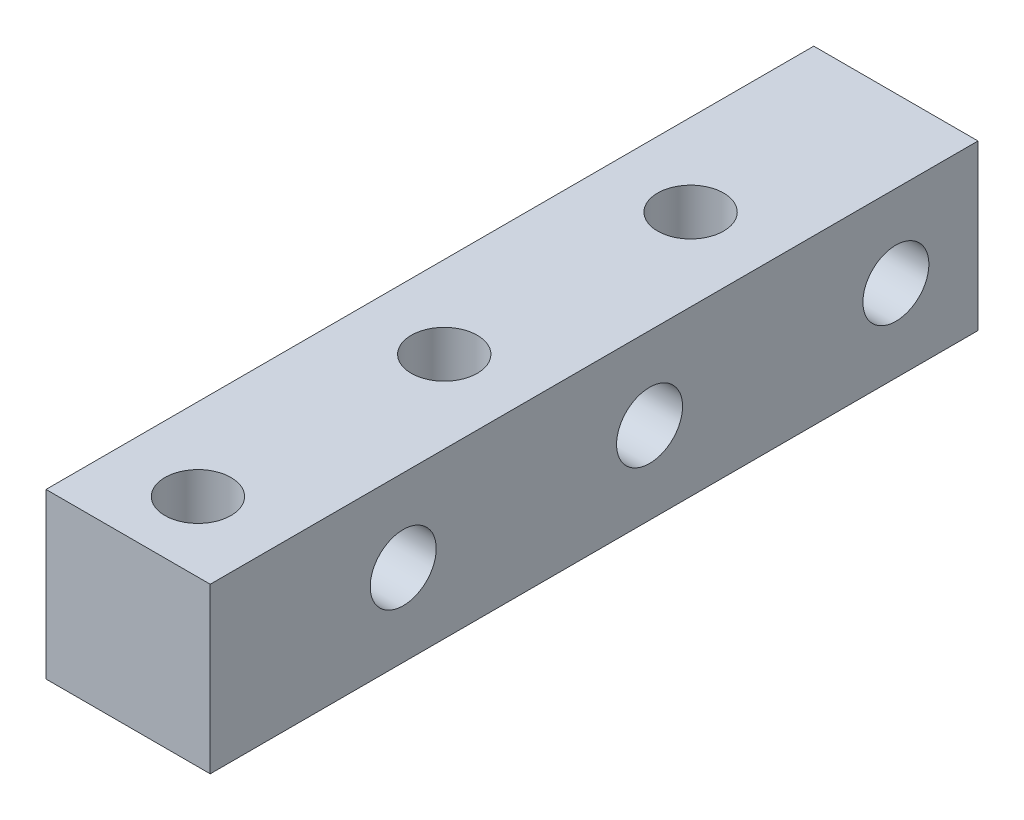
ISO-10303-21;
HEADER;
FILE_DESCRIPTION(('STEP AP214'),'2;1');
FILE_NAME('part.step','',(''),(''),'','','');
FILE_SCHEMA(('AUTOMOTIVE_DESIGN { 1 0 10303 214 1 1 1 1 }'));
ENDSEC;
DATA;
#1=APPLICATION_CONTEXT('core data for automotive mechanical design processes');
#2=APPLICATION_PROTOCOL_DEFINITION('international standard','automotive_design',2000,#1);
#3=PRODUCT_CONTEXT('',#1,'mechanical');
#4=PRODUCT('Part','Part','',(#3));
#5=PRODUCT_RELATED_PRODUCT_CATEGORY('part','',(#4));
#6=PRODUCT_DEFINITION_FORMATION('','',#4);
#7=PRODUCT_DEFINITION_CONTEXT('part definition',#1,'design');
#8=PRODUCT_DEFINITION('design','',#6,#7);
#9=PRODUCT_DEFINITION_SHAPE('','',#8);
#10=(LENGTH_UNIT() NAMED_UNIT(*) SI_UNIT(.MILLI.,.METRE.));
#11=(NAMED_UNIT(*) PLANE_ANGLE_UNIT() SI_UNIT($,.RADIAN.));
#12=(NAMED_UNIT(*) SI_UNIT($,.STERADIAN.) SOLID_ANGLE_UNIT());
#13=UNCERTAINTY_MEASURE_WITH_UNIT(LENGTH_MEASURE(1.E-05),#10,'distance_accuracy_value','');
#14=(GEOMETRIC_REPRESENTATION_CONTEXT(3) GLOBAL_UNCERTAINTY_ASSIGNED_CONTEXT((#13)) GLOBAL_UNIT_ASSIGNED_CONTEXT((#10,
#11,#12)) REPRESENTATION_CONTEXT('',''));
#15=CARTESIAN_POINT('',(0.,0.,0.));
#16=DIRECTION('',(0.,0.,1.));
#17=DIRECTION('',(1.,0.,0.));
#18=AXIS2_PLACEMENT_3D('',#15,#16,#17);
#19=CARTESIAN_POINT('',(6.35,-6.35,-85.725));
#20=DIRECTION('',(0.,-1.,0.));
#21=DIRECTION('',(1.,0.,0.));
#22=AXIS2_PLACEMENT_3D('',#19,#20,#21);
#23=PLANE('',#22);
#24=CARTESIAN_POINT('',(0.,-6.35,-25.4));
#25=DIRECTION('',(0.,1.,0.));
#26=DIRECTION('',(0.,0.,1.));
#27=AXIS2_PLACEMENT_3D('',#24,#25,#26);
#28=CIRCLE('',#27,2.5527);
#29=CARTESIAN_POINT('',(0.,-6.35,-22.8473));
#30=VERTEX_POINT('',#29);
#31=EDGE_CURVE('E124',#30,#30,#28,.T.);
#32=ORIENTED_EDGE('',*,*,#31,.T.);
#33=EDGE_LOOP('',(#32));
#34=FACE_BOUND('',#33,.T.);
#35=CARTESIAN_POINT('',(0.,-6.35,-44.45));
#36=DIRECTION('',(0.,1.,0.));
#37=DIRECTION('',(0.,0.,1.));
#38=AXIS2_PLACEMENT_3D('',#35,#36,#37);
#39=CIRCLE('',#38,2.5527);
#40=CARTESIAN_POINT('',(0.,-6.35,-41.8973));
#41=VERTEX_POINT('',#40);
#42=EDGE_CURVE('E164',#41,#41,#39,.T.);
#43=ORIENTED_EDGE('',*,*,#42,.T.);
#44=EDGE_LOOP('',(#43));
#45=FACE_BOUND('',#44,.T.);
#46=CARTESIAN_POINT('',(0.,-6.35,-63.5));
#47=DIRECTION('',(0.,1.,0.));
#48=DIRECTION('',(0.,0.,1.));
#49=AXIS2_PLACEMENT_3D('',#46,#47,#48);
#50=CIRCLE('',#49,2.5527);
#51=CARTESIAN_POINT('',(0.,-6.35,-60.9473));
#52=VERTEX_POINT('',#51);
#53=EDGE_CURVE('E159',#52,#52,#50,.T.);
#54=ORIENTED_EDGE('',*,*,#53,.T.);
#55=EDGE_LOOP('',(#54));
#56=FACE_BOUND('',#55,.T.);
#57=DIRECTION('',(0.,0.,-1.));
#58=VECTOR('',#57,1.);
#59=CARTESIAN_POINT('',(6.35,-6.35,-85.725));
#60=LINE('',#59,#58);
#61=CARTESIAN_POINT('',(6.35,-6.35,-20.));
#62=VERTEX_POINT('',#61);
#63=CARTESIAN_POINT('',(6.35,-6.35,-79.375));
#64=VERTEX_POINT('',#63);
#65=EDGE_CURVE('E127',#62,#64,#60,.T.);
#66=ORIENTED_EDGE('',*,*,#65,.F.);
#67=DIRECTION('',(1.,0.,0.));
#68=VECTOR('',#67,1.);
#69=CARTESIAN_POINT('',(0.,-6.35,-20.));
#70=LINE('',#69,#68);
#71=CARTESIAN_POINT('',(-6.35000000000001,-6.35,-20.));
#72=VERTEX_POINT('',#71);
#73=EDGE_CURVE('E95',#72,#62,#70,.T.);
#74=ORIENTED_EDGE('',*,*,#73,.F.);
#75=DIRECTION('',(0.,0.,1.));
#76=VECTOR('',#75,1.);
#77=CARTESIAN_POINT('',(-6.35,-6.35,-85.725));
#78=LINE('',#77,#76);
#79=CARTESIAN_POINT('',(-6.35,-6.35,-79.375));
#80=VERTEX_POINT('',#79);
#81=EDGE_CURVE('E112',#80,#72,#78,.T.);
#82=ORIENTED_EDGE('',*,*,#81,.F.);
#83=DIRECTION('',(1.,0.,0.));
#84=VECTOR('',#83,1.);
#85=CARTESIAN_POINT('',(-6.35000000000001,-6.35,-79.375));
#86=LINE('',#85,#84);
#87=EDGE_CURVE('E89',#80,#64,#86,.T.);
#88=ORIENTED_EDGE('',*,*,#87,.T.);
#89=EDGE_LOOP('',(#66,#74,#82,#88));
#90=FACE_BOUND('',#89,.T.);
#91=ADVANCED_FACE('F49',(#34,#45,#56,#90),#23,.T.);
#92=CARTESIAN_POINT('',(-6.35,-6.35,-85.725));
#93=DIRECTION('',(-1.,0.,0.));
#94=DIRECTION('',(0.,0.,1.));
#95=AXIS2_PLACEMENT_3D('',#92,#93,#94);
#96=PLANE('',#95);
#97=CARTESIAN_POINT('',(-6.35,0.,-73.025));
#98=DIRECTION('',(1.,0.,0.));
#99=DIRECTION('',(0.,0.,-1.));
#100=AXIS2_PLACEMENT_3D('',#97,#98,#99);
#101=CIRCLE('',#100,2.55269999999999);
#102=CARTESIAN_POINT('',(-6.35,0.,-75.5777));
#103=VERTEX_POINT('',#102);
#104=EDGE_CURVE('E53',#103,#103,#101,.T.);
#105=ORIENTED_EDGE('',*,*,#104,.T.);
#106=EDGE_LOOP('',(#105));
#107=FACE_BOUND('',#106,.T.);
#108=CARTESIAN_POINT('',(-6.35,0.,-53.975));
#109=DIRECTION('',(1.,0.,0.));
#110=DIRECTION('',(0.,0.,-1.));
#111=AXIS2_PLACEMENT_3D('',#108,#109,#110);
#112=CIRCLE('',#111,2.5527);
#113=CARTESIAN_POINT('',(-6.35,0.,-56.5277));
#114=VERTEX_POINT('',#113);
#115=EDGE_CURVE('E180',#114,#114,#112,.T.);
#116=ORIENTED_EDGE('',*,*,#115,.T.);
#117=EDGE_LOOP('',(#116));
#118=FACE_BOUND('',#117,.T.);
#119=CARTESIAN_POINT('',(-6.35,0.,-34.925));
#120=DIRECTION('',(1.,0.,0.));
#121=DIRECTION('',(0.,0.,-1.));
#122=AXIS2_PLACEMENT_3D('',#119,#120,#121);
#123=CIRCLE('',#122,2.5527);
#124=CARTESIAN_POINT('',(-6.35,0.,-37.4777));
#125=VERTEX_POINT('',#124);
#126=EDGE_CURVE('E135',#125,#125,#123,.T.);
#127=ORIENTED_EDGE('',*,*,#126,.T.);
#128=EDGE_LOOP('',(#127));
#129=FACE_BOUND('',#128,.T.);
#130=ORIENTED_EDGE('',*,*,#81,.T.);
#131=DIRECTION('',(0.,1.,0.));
#132=VECTOR('',#131,1.);
#133=CARTESIAN_POINT('',(-6.35000000000001,-6.35,-20.));
#134=LINE('',#133,#132);
#135=CARTESIAN_POINT('',(-6.35,6.35,-20.));
#136=VERTEX_POINT('',#135);
#137=EDGE_CURVE('E101',#72,#136,#134,.T.);
#138=ORIENTED_EDGE('',*,*,#137,.T.);
#139=DIRECTION('',(0.,0.,1.));
#140=VECTOR('',#139,1.);
#141=CARTESIAN_POINT('',(-6.35,6.35,-85.725));
#142=LINE('',#141,#140);
#143=CARTESIAN_POINT('',(-6.35,6.35,-79.375));
#144=VERTEX_POINT('',#143);
#145=EDGE_CURVE('E110',#144,#136,#142,.T.);
#146=ORIENTED_EDGE('',*,*,#145,.F.);
#147=DIRECTION('',(0.,1.,0.));
#148=VECTOR('',#147,1.);
#149=CARTESIAN_POINT('',(-6.35,-6.35,-79.375));
#150=LINE('',#149,#148);
#151=EDGE_CURVE('E77',#144,#80,#150,.F.);
#152=ORIENTED_EDGE('',*,*,#151,.T.);
#153=EDGE_LOOP('',(#130,#138,#146,#152));
#154=FACE_BOUND('',#153,.T.);
#155=ADVANCED_FACE('F109',(#107,#118,#129,#154),#96,.T.);
#156=CARTESIAN_POINT('',(6.35,-6.35,-85.725));
#157=DIRECTION('',(1.,0.,0.));
#158=DIRECTION('',(0.,0.,-1.));
#159=AXIS2_PLACEMENT_3D('',#156,#157,#158);
#160=PLANE('',#159);
#161=CARTESIAN_POINT('',(6.35,0.,-73.025));
#162=DIRECTION('',(1.,0.,0.));
#163=DIRECTION('',(0.,0.,-1.));
#164=AXIS2_PLACEMENT_3D('',#161,#162,#163);
#165=CIRCLE('',#164,2.55269999999999);
#166=CARTESIAN_POINT('',(6.35,0.,-75.5777));
#167=VERTEX_POINT('',#166);
#168=EDGE_CURVE('E130',#167,#167,#165,.F.);
#169=ORIENTED_EDGE('',*,*,#168,.T.);
#170=EDGE_LOOP('',(#169));
#171=FACE_BOUND('',#170,.T.);
#172=CARTESIAN_POINT('',(6.35,0.,-53.975));
#173=DIRECTION('',(1.,0.,0.));
#174=DIRECTION('',(0.,0.,-1.));
#175=AXIS2_PLACEMENT_3D('',#172,#173,#174);
#176=CIRCLE('',#175,2.5527);
#177=CARTESIAN_POINT('',(6.35,0.,-56.5277));
#178=VERTEX_POINT('',#177);
#179=EDGE_CURVE('E171',#178,#178,#176,.F.);
#180=ORIENTED_EDGE('',*,*,#179,.T.);
#181=EDGE_LOOP('',(#180));
#182=FACE_BOUND('',#181,.T.);
#183=CARTESIAN_POINT('',(6.35,0.,-34.925));
#184=DIRECTION('',(1.,0.,0.));
#185=DIRECTION('',(0.,0.,-1.));
#186=AXIS2_PLACEMENT_3D('',#183,#184,#185);
#187=CIRCLE('',#186,2.5527);
#188=CARTESIAN_POINT('',(6.35,0.,-37.4777));
#189=VERTEX_POINT('',#188);
#190=EDGE_CURVE('E165',#189,#189,#187,.F.);
#191=ORIENTED_EDGE('',*,*,#190,.T.);
#192=EDGE_LOOP('',(#191));
#193=FACE_BOUND('',#192,.T.);
#194=DIRECTION('',(0.,0.,1.));
#195=VECTOR('',#194,1.);
#196=CARTESIAN_POINT('',(6.35,6.35,-85.725));
#197=LINE('',#196,#195);
#198=CARTESIAN_POINT('',(6.35,6.35,-20.));
#199=VERTEX_POINT('',#198);
#200=CARTESIAN_POINT('',(6.35,6.35,-79.375));
#201=VERTEX_POINT('',#200);
#202=EDGE_CURVE('E118',#199,#201,#197,.F.);
#203=ORIENTED_EDGE('',*,*,#202,.F.);
#204=DIRECTION('',(0.,1.,0.));
#205=VECTOR('',#204,1.);
#206=CARTESIAN_POINT('',(6.35,-6.35,-20.));
#207=LINE('',#206,#205);
#208=EDGE_CURVE('E68',#62,#199,#207,.T.);
#209=ORIENTED_EDGE('',*,*,#208,.F.);
#210=ORIENTED_EDGE('',*,*,#65,.T.);
#211=DIRECTION('',(0.,1.,0.));
#212=VECTOR('',#211,1.);
#213=CARTESIAN_POINT('',(6.35,-6.35,-79.375));
#214=LINE('',#213,#212);
#215=EDGE_CURVE('E131',#64,#201,#214,.T.);
#216=ORIENTED_EDGE('',*,*,#215,.T.);
#217=EDGE_LOOP('',(#203,#209,#210,#216));
#218=FACE_BOUND('',#217,.T.);
#219=ADVANCED_FACE('F200',(#171,#182,#193,#218),#160,.T.);
#220=CARTESIAN_POINT('',(6.35,6.35,-85.725));
#221=DIRECTION('',(0.,1.,0.));
#222=DIRECTION('',(-1.,0.,0.));
#223=AXIS2_PLACEMENT_3D('',#220,#221,#222);
#224=PLANE('',#223);
#225=CARTESIAN_POINT('',(0.,6.35,-63.5));
#226=DIRECTION('',(0.,1.,0.));
#227=DIRECTION('',(0.,0.,1.));
#228=AXIS2_PLACEMENT_3D('',#225,#226,#227);
#229=CIRCLE('',#228,2.5527);
#230=CARTESIAN_POINT('',(0.,6.35,-60.9473));
#231=VERTEX_POINT('',#230);
#232=EDGE_CURVE('E122',#231,#231,#229,.F.);
#233=ORIENTED_EDGE('',*,*,#232,.T.);
#234=EDGE_LOOP('',(#233));
#235=FACE_BOUND('',#234,.T.);
#236=CARTESIAN_POINT('',(0.,6.35,-44.45));
#237=DIRECTION('',(0.,1.,0.));
#238=DIRECTION('',(0.,0.,1.));
#239=AXIS2_PLACEMENT_3D('',#236,#237,#238);
#240=CIRCLE('',#239,2.5527);
#241=CARTESIAN_POINT('',(0.,6.35,-41.8973));
#242=VERTEX_POINT('',#241);
#243=EDGE_CURVE('E60',#242,#242,#240,.F.);
#244=ORIENTED_EDGE('',*,*,#243,.T.);
#245=EDGE_LOOP('',(#244));
#246=FACE_BOUND('',#245,.T.);
#247=CARTESIAN_POINT('',(0.,6.35,-25.4));
#248=DIRECTION('',(0.,1.,0.));
#249=DIRECTION('',(0.,0.,1.));
#250=AXIS2_PLACEMENT_3D('',#247,#248,#249);
#251=CIRCLE('',#250,2.5527);
#252=CARTESIAN_POINT('',(0.,6.35,-22.8473));
#253=VERTEX_POINT('',#252);
#254=EDGE_CURVE('E12',#253,#253,#251,.F.);
#255=ORIENTED_EDGE('',*,*,#254,.T.);
#256=EDGE_LOOP('',(#255));
#257=FACE_BOUND('',#256,.T.);
#258=ORIENTED_EDGE('',*,*,#145,.T.);
#259=DIRECTION('',(1.,0.,0.));
#260=VECTOR('',#259,1.);
#261=CARTESIAN_POINT('',(0.,6.35,-20.));
#262=LINE('',#261,#260);
#263=EDGE_CURVE('E98',#136,#199,#262,.T.);
#264=ORIENTED_EDGE('',*,*,#263,.T.);
#265=ORIENTED_EDGE('',*,*,#202,.T.);
#266=DIRECTION('',(-1.,0.,0.));
#267=VECTOR('',#266,1.);
#268=CARTESIAN_POINT('',(6.35,6.35,-79.375));
#269=LINE('',#268,#267);
#270=EDGE_CURVE('E116',#201,#144,#269,.T.);
#271=ORIENTED_EDGE('',*,*,#270,.T.);
#272=EDGE_LOOP('',(#258,#264,#265,#271));
#273=FACE_BOUND('',#272,.T.);
#274=ADVANCED_FACE('F115',(#235,#246,#257,#273),#224,.T.);
#275=CARTESIAN_POINT('',(6.35,0.,-73.025));
#276=DIRECTION('',(1.,0.,0.));
#277=DIRECTION('',(0.,0.,-1.));
#278=AXIS2_PLACEMENT_3D('',#275,#276,#277);
#279=CYLINDRICAL_SURFACE('',#278,2.55269999999999);
#280=ORIENTED_EDGE('',*,*,#168,.F.);
#281=EDGE_LOOP('',(#280));
#282=FACE_BOUND('',#281,.T.);
#283=ORIENTED_EDGE('',*,*,#104,.F.);
#284=EDGE_LOOP('',(#283));
#285=FACE_BOUND('',#284,.T.);
#286=ADVANCED_FACE('F51',(#282,#285),#279,.F.);
#287=CARTESIAN_POINT('',(6.35,0.,-53.975));
#288=DIRECTION('',(1.,0.,0.));
#289=DIRECTION('',(0.,0.,-1.));
#290=AXIS2_PLACEMENT_3D('',#287,#288,#289);
#291=CYLINDRICAL_SURFACE('',#290,2.5527);
#292=ORIENTED_EDGE('',*,*,#179,.F.);
#293=EDGE_LOOP('',(#292));
#294=FACE_BOUND('',#293,.T.);
#295=ORIENTED_EDGE('',*,*,#115,.F.);
#296=EDGE_LOOP('',(#295));
#297=FACE_BOUND('',#296,.T.);
#298=ADVANCED_FACE('F192',(#294,#297),#291,.F.);
#299=CARTESIAN_POINT('',(6.35,0.,-34.925));
#300=DIRECTION('',(1.,0.,0.));
#301=DIRECTION('',(0.,0.,-1.));
#302=AXIS2_PLACEMENT_3D('',#299,#300,#301);
#303=CYLINDRICAL_SURFACE('',#302,2.5527);
#304=ORIENTED_EDGE('',*,*,#190,.F.);
#305=EDGE_LOOP('',(#304));
#306=FACE_BOUND('',#305,.T.);
#307=ORIENTED_EDGE('',*,*,#126,.F.);
#308=EDGE_LOOP('',(#307));
#309=FACE_BOUND('',#308,.T.);
#310=ADVANCED_FACE('F198',(#306,#309),#303,.F.);
#311=CARTESIAN_POINT('',(-6.35000000000001,6.35,-79.375));
#312=DIRECTION('',(0.,0.,1.));
#313=DIRECTION('',(1.,0.,0.));
#314=AXIS2_PLACEMENT_3D('',#311,#312,#313);
#315=PLANE('',#314);
#316=ORIENTED_EDGE('',*,*,#87,.F.);
#317=ORIENTED_EDGE('',*,*,#151,.F.);
#318=ORIENTED_EDGE('',*,*,#270,.F.);
#319=ORIENTED_EDGE('',*,*,#215,.F.);
#320=EDGE_LOOP('',(#316,#317,#318,#319));
#321=FACE_BOUND('',#320,.T.);
#322=ADVANCED_FACE('F218',(#321),#315,.F.);
#323=CARTESIAN_POINT('',(0.,6.35,-63.5));
#324=DIRECTION('',(0.,1.,0.));
#325=DIRECTION('',(0.,0.,1.));
#326=AXIS2_PLACEMENT_3D('',#323,#324,#325);
#327=CYLINDRICAL_SURFACE('',#326,2.5527);
#328=ORIENTED_EDGE('',*,*,#232,.F.);
#329=EDGE_LOOP('',(#328));
#330=FACE_BOUND('',#329,.T.);
#331=ORIENTED_EDGE('',*,*,#53,.F.);
#332=EDGE_LOOP('',(#331));
#333=FACE_BOUND('',#332,.T.);
#334=ADVANCED_FACE('F224',(#330,#333),#327,.F.);
#335=CARTESIAN_POINT('',(0.,6.35,-44.45));
#336=DIRECTION('',(0.,1.,0.));
#337=DIRECTION('',(0.,0.,1.));
#338=AXIS2_PLACEMENT_3D('',#335,#336,#337);
#339=CYLINDRICAL_SURFACE('',#338,2.5527);
#340=ORIENTED_EDGE('',*,*,#243,.F.);
#341=EDGE_LOOP('',(#340));
#342=FACE_BOUND('',#341,.T.);
#343=ORIENTED_EDGE('',*,*,#42,.F.);
#344=EDGE_LOOP('',(#343));
#345=FACE_BOUND('',#344,.T.);
#346=ADVANCED_FACE('F246',(#342,#345),#339,.F.);
#347=CARTESIAN_POINT('',(0.,6.35,-25.4));
#348=DIRECTION('',(0.,1.,0.));
#349=DIRECTION('',(0.,0.,1.));
#350=AXIS2_PLACEMENT_3D('',#347,#348,#349);
#351=CYLINDRICAL_SURFACE('',#350,2.5527);
#352=ORIENTED_EDGE('',*,*,#254,.F.);
#353=EDGE_LOOP('',(#352));
#354=FACE_BOUND('',#353,.T.);
#355=ORIENTED_EDGE('',*,*,#31,.F.);
#356=EDGE_LOOP('',(#355));
#357=FACE_BOUND('',#356,.T.);
#358=ADVANCED_FACE('F203',(#354,#357),#351,.F.);
#359=CARTESIAN_POINT('',(0.,-6.35,-20.));
#360=DIRECTION('',(0.,0.,1.));
#361=DIRECTION('',(1.,0.,0.));
#362=AXIS2_PLACEMENT_3D('',#359,#360,#361);
#363=PLANE('',#362);
#364=ORIENTED_EDGE('',*,*,#263,.F.);
#365=ORIENTED_EDGE('',*,*,#137,.F.);
#366=ORIENTED_EDGE('',*,*,#73,.T.);
#367=ORIENTED_EDGE('',*,*,#208,.T.);
#368=EDGE_LOOP('',(#364,#365,#366,#367));
#369=FACE_BOUND('',#368,.T.);
#370=ADVANCED_FACE('F100',(#369),#363,.T.);
#371=CLOSED_SHELL('',(#91,#155,#219,#274,#286,#298,#310,#322,#334,#346,#358,#370));
#372=MANIFOLD_SOLID_BREP('B2',#371);
#373=ADVANCED_BREP_SHAPE_REPRESENTATION('',(#18,#372),#14);
#374=SHAPE_DEFINITION_REPRESENTATION(#9,#373);
ENDSEC;
END-ISO-10303-21;
